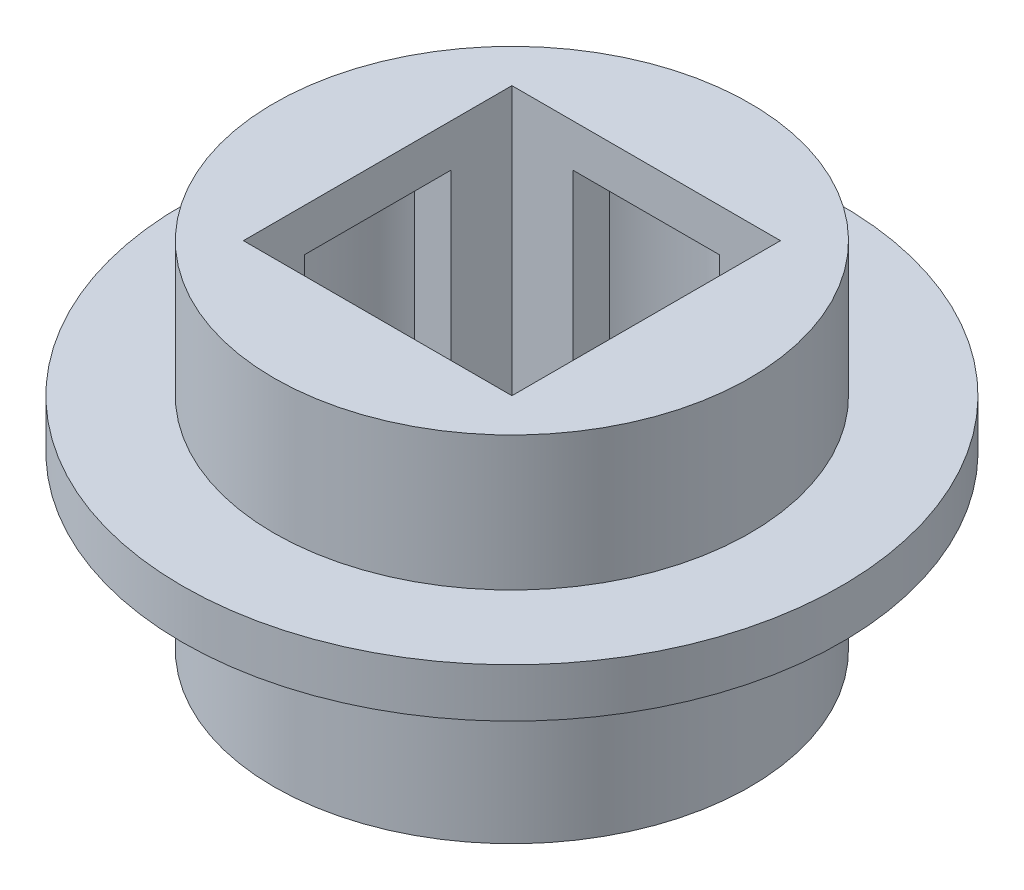
ISO-10303-21;
HEADER;
FILE_DESCRIPTION(('STEP AP214'),'2;1');
FILE_NAME('part.step','',(''),(''),'','','');
FILE_SCHEMA(('AUTOMOTIVE_DESIGN { 1 0 10303 214 1 1 1 1 }'));
ENDSEC;
DATA;
#1=APPLICATION_CONTEXT('core data for automotive mechanical design processes');
#2=APPLICATION_PROTOCOL_DEFINITION('international standard','automotive_design',2000,#1);
#3=PRODUCT_CONTEXT('',#1,'mechanical');
#4=PRODUCT('Part','Part','',(#3));
#5=PRODUCT_RELATED_PRODUCT_CATEGORY('part','',(#4));
#6=PRODUCT_DEFINITION_FORMATION('','',#4);
#7=PRODUCT_DEFINITION_CONTEXT('part definition',#1,'design');
#8=PRODUCT_DEFINITION('design','',#6,#7);
#9=PRODUCT_DEFINITION_SHAPE('','',#8);
#10=(LENGTH_UNIT() NAMED_UNIT(*) SI_UNIT(.MILLI.,.METRE.));
#11=(NAMED_UNIT(*) PLANE_ANGLE_UNIT() SI_UNIT($,.RADIAN.));
#12=(NAMED_UNIT(*) SI_UNIT($,.STERADIAN.) SOLID_ANGLE_UNIT());
#13=UNCERTAINTY_MEASURE_WITH_UNIT(LENGTH_MEASURE(1.E-05),#10,'distance_accuracy_value','');
#14=(GEOMETRIC_REPRESENTATION_CONTEXT(3) GLOBAL_UNCERTAINTY_ASSIGNED_CONTEXT((#13)) GLOBAL_UNIT_ASSIGNED_CONTEXT((#10,
#11,#12)) REPRESENTATION_CONTEXT('',''));
#15=CARTESIAN_POINT('',(0.,0.,0.));
#16=DIRECTION('',(0.,0.,1.));
#17=DIRECTION('',(1.,0.,0.));
#18=AXIS2_PLACEMENT_3D('',#15,#16,#17);
#19=CARTESIAN_POINT('',(0.,-14.,0.));
#20=DIRECTION('',(0.,1.,0.));
#21=DIRECTION('',(0.,0.,1.));
#22=AXIS2_PLACEMENT_3D('',#19,#20,#21);
#23=CYLINDRICAL_SURFACE('',#22,19.5);
#24=CARTESIAN_POINT('',(0.,-14.,0.));
#25=DIRECTION('',(0.,1.,0.));
#26=DIRECTION('',(0.,0.,1.));
#27=AXIS2_PLACEMENT_3D('',#24,#25,#26);
#28=CIRCLE('',#27,19.5);
#29=CARTESIAN_POINT('',(0.,-14.,19.5));
#30=VERTEX_POINT('',#29);
#31=EDGE_CURVE('E12',#30,#30,#28,.T.);
#32=ORIENTED_EDGE('',*,*,#31,.T.);
#33=EDGE_LOOP('',(#32));
#34=FACE_BOUND('',#33,.T.);
#35=CARTESIAN_POINT('',(0.,15.,0.));
#36=DIRECTION('',(0.,1.,0.));
#37=DIRECTION('',(0.,0.,1.));
#38=AXIS2_PLACEMENT_3D('',#35,#36,#37);
#39=CIRCLE('',#38,19.5);
#40=CARTESIAN_POINT('',(0.,15.,19.5));
#41=VERTEX_POINT('',#40);
#42=EDGE_CURVE('E50',#41,#41,#39,.T.);
#43=ORIENTED_EDGE('',*,*,#42,.F.);
#44=EDGE_LOOP('',(#43));
#45=FACE_BOUND('',#44,.T.);
#46=ADVANCED_FACE('F43',(#34,#45),#23,.T.);
#47=CARTESIAN_POINT('',(0.,-14.,0.));
#48=DIRECTION('',(0.,1.,0.));
#49=DIRECTION('',(0.,0.,1.));
#50=AXIS2_PLACEMENT_3D('',#47,#48,#49);
#51=PLANE('',#50);
#52=CARTESIAN_POINT('',(0.,-14.,8.));
#53=DIRECTION('',(0.,-1.,0.));
#54=DIRECTION('',(0.,0.,1.));
#55=AXIS2_PLACEMENT_3D('',#52,#53,#54);
#56=CIRCLE('',#55,8.48528137423857);
#57=CARTESIAN_POINT('',(6.,-14.,14.));
#58=VERTEX_POINT('',#57);
#59=CARTESIAN_POINT('',(-6.,-14.,14.));
#60=VERTEX_POINT('',#59);
#61=EDGE_CURVE('E203',#58,#60,#56,.T.);
#62=ORIENTED_EDGE('',*,*,#61,.F.);
#63=DIRECTION('',(0.,0.,1.));
#64=VECTOR('',#63,1.);
#65=CARTESIAN_POINT('',(6.,-14.,11.));
#66=LINE('',#65,#64);
#67=CARTESIAN_POINT('',(6.,-14.,11.));
#68=VERTEX_POINT('',#67);
#69=EDGE_CURVE('E188',#68,#58,#66,.T.);
#70=ORIENTED_EDGE('',*,*,#69,.F.);
#71=DIRECTION('',(-1.,0.,0.));
#72=VECTOR('',#71,1.);
#73=CARTESIAN_POINT('',(-11.,-14.,11.));
#74=LINE('',#73,#72);
#75=CARTESIAN_POINT('',(11.,-14.,11.));
#76=VERTEX_POINT('',#75);
#77=EDGE_CURVE('E302',#76,#68,#74,.T.);
#78=ORIENTED_EDGE('',*,*,#77,.F.);
#79=DIRECTION('',(0.,0.,1.));
#80=VECTOR('',#79,1.);
#81=CARTESIAN_POINT('',(11.,-14.,11.));
#82=LINE('',#81,#80);
#83=CARTESIAN_POINT('',(11.,-14.,5.99999999999996));
#84=VERTEX_POINT('',#83);
#85=EDGE_CURVE('E305',#84,#76,#82,.T.);
#86=ORIENTED_EDGE('',*,*,#85,.F.);
#87=DIRECTION('',(-1.,0.,0.));
#88=VECTOR('',#87,1.);
#89=CARTESIAN_POINT('',(11.,-14.,5.99999999999996));
#90=LINE('',#89,#88);
#91=CARTESIAN_POINT('',(14.,-14.,5.99999999999995));
#92=VERTEX_POINT('',#91);
#93=EDGE_CURVE('E222',#92,#84,#90,.T.);
#94=ORIENTED_EDGE('',*,*,#93,.F.);
#95=CARTESIAN_POINT('',(8.,-14.,0.));
#96=DIRECTION('',(0.,-1.,0.));
#97=DIRECTION('',(0.,0.,1.));
#98=AXIS2_PLACEMENT_3D('',#95,#96,#97);
#99=CIRCLE('',#98,8.48528137423857);
#100=CARTESIAN_POINT('',(14.,-14.,-6.00000000000005));
#101=VERTEX_POINT('',#100);
#102=EDGE_CURVE('E231',#101,#92,#99,.T.);
#103=ORIENTED_EDGE('',*,*,#102,.F.);
#104=DIRECTION('',(1.,0.,0.));
#105=VECTOR('',#104,1.);
#106=CARTESIAN_POINT('',(11.,-14.,-6.00000000000004));
#107=LINE('',#106,#105);
#108=CARTESIAN_POINT('',(11.,-14.,-6.00000000000004));
#109=VERTEX_POINT('',#108);
#110=EDGE_CURVE('E228',#109,#101,#107,.T.);
#111=ORIENTED_EDGE('',*,*,#110,.F.);
#112=CARTESIAN_POINT('',(11.,-14.,-11.));
#113=VERTEX_POINT('',#112);
#114=EDGE_CURVE('E306',#113,#109,#82,.T.);
#115=ORIENTED_EDGE('',*,*,#114,.F.);
#116=DIRECTION('',(1.,0.,0.));
#117=VECTOR('',#116,1.);
#118=CARTESIAN_POINT('',(-11.,-14.,-11.));
#119=LINE('',#118,#117);
#120=CARTESIAN_POINT('',(5.99999999999992,-14.,-11.));
#121=VERTEX_POINT('',#120);
#122=EDGE_CURVE('E323',#121,#113,#119,.T.);
#123=ORIENTED_EDGE('',*,*,#122,.F.);
#124=DIRECTION('',(0.,0.,1.));
#125=VECTOR('',#124,1.);
#126=CARTESIAN_POINT('',(5.99999999999992,-14.,-11.));
#127=LINE('',#126,#125);
#128=CARTESIAN_POINT('',(5.9999999999999,-14.,-14.));
#129=VERTEX_POINT('',#128);
#130=EDGE_CURVE('E247',#129,#121,#127,.T.);
#131=ORIENTED_EDGE('',*,*,#130,.F.);
#132=CARTESIAN_POINT('',(0.,-14.,-8.));
#133=DIRECTION('',(0.,-1.,0.));
#134=DIRECTION('',(0.,0.,1.));
#135=AXIS2_PLACEMENT_3D('',#132,#133,#134);
#136=CIRCLE('',#135,8.48528137423857);
#137=CARTESIAN_POINT('',(-6.0000000000001,-14.,-14.));
#138=VERTEX_POINT('',#137);
#139=EDGE_CURVE('E259',#138,#129,#136,.T.);
#140=ORIENTED_EDGE('',*,*,#139,.F.);
#141=DIRECTION('',(0.,0.,-1.));
#142=VECTOR('',#141,1.);
#143=CARTESIAN_POINT('',(-6.00000000000008,-14.,-11.));
#144=LINE('',#143,#142);
#145=CARTESIAN_POINT('',(-6.00000000000008,-14.,-11.));
#146=VERTEX_POINT('',#145);
#147=EDGE_CURVE('E256',#146,#138,#144,.T.);
#148=ORIENTED_EDGE('',*,*,#147,.F.);
#149=CARTESIAN_POINT('',(-11.,-14.,-11.));
#150=VERTEX_POINT('',#149);
#151=EDGE_CURVE('E330',#150,#146,#119,.T.);
#152=ORIENTED_EDGE('',*,*,#151,.F.);
#153=DIRECTION('',(0.,0.,-1.));
#154=VECTOR('',#153,1.);
#155=CARTESIAN_POINT('',(-11.,-14.,11.));
#156=LINE('',#155,#154);
#157=CARTESIAN_POINT('',(-11.0000000000001,-14.,-5.99999999999988));
#158=VERTEX_POINT('',#157);
#159=EDGE_CURVE('E213',#158,#150,#156,.T.);
#160=ORIENTED_EDGE('',*,*,#159,.F.);
#161=DIRECTION('',(1.,0.,0.));
#162=VECTOR('',#161,1.);
#163=CARTESIAN_POINT('',(-11.0000000000001,-14.,-5.99999999999988));
#164=LINE('',#163,#162);
#165=CARTESIAN_POINT('',(-14.0000000000001,-14.,-5.99999999999985));
#166=VERTEX_POINT('',#165);
#167=EDGE_CURVE('E275',#166,#158,#164,.T.);
#168=ORIENTED_EDGE('',*,*,#167,.F.);
#169=CARTESIAN_POINT('',(-8.,-14.,0.));
#170=DIRECTION('',(0.,-1.,0.));
#171=DIRECTION('',(0.,0.,1.));
#172=AXIS2_PLACEMENT_3D('',#169,#170,#171);
#173=CIRCLE('',#172,8.48528137423857);
#174=CARTESIAN_POINT('',(-13.9999999999999,-14.,6.00000000000014));
#175=VERTEX_POINT('',#174);
#176=EDGE_CURVE('E287',#175,#166,#173,.T.);
#177=ORIENTED_EDGE('',*,*,#176,.F.);
#178=DIRECTION('',(-1.,0.,0.));
#179=VECTOR('',#178,1.);
#180=CARTESIAN_POINT('',(-10.9999999999999,-14.,6.00000000000012));
#181=LINE('',#180,#179);
#182=CARTESIAN_POINT('',(-10.9999999999999,-14.,6.00000000000012));
#183=VERTEX_POINT('',#182);
#184=EDGE_CURVE('E284',#183,#175,#181,.T.);
#185=ORIENTED_EDGE('',*,*,#184,.F.);
#186=CARTESIAN_POINT('',(-11.,-14.,11.));
#187=VERTEX_POINT('',#186);
#188=EDGE_CURVE('E298',#187,#183,#156,.T.);
#189=ORIENTED_EDGE('',*,*,#188,.F.);
#190=CARTESIAN_POINT('',(-6.,-14.,11.));
#191=VERTEX_POINT('',#190);
#192=EDGE_CURVE('E301',#191,#187,#74,.T.);
#193=ORIENTED_EDGE('',*,*,#192,.F.);
#194=DIRECTION('',(0.,0.,-1.));
#195=VECTOR('',#194,1.);
#196=CARTESIAN_POINT('',(-6.,-14.,11.));
#197=LINE('',#196,#195);
#198=EDGE_CURVE('E201',#60,#191,#197,.T.);
#199=ORIENTED_EDGE('',*,*,#198,.F.);
#200=EDGE_LOOP('',(#62,#70,#78,#86,#94,#103,#111,#115,#123,#131,#140,#148,#152,#160,#168,#177,
#185,#189,#193,#199));
#201=FACE_BOUND('',#200,.T.);
#202=ORIENTED_EDGE('',*,*,#31,.F.);
#203=EDGE_LOOP('',(#202));
#204=FACE_BOUND('',#203,.T.);
#205=ADVANCED_FACE('F338',(#201,#204),#51,.F.);
#206=CARTESIAN_POINT('',(0.,15.,0.));
#207=DIRECTION('',(0.,1.,0.));
#208=DIRECTION('',(0.,0.,1.));
#209=AXIS2_PLACEMENT_3D('',#206,#207,#208);
#210=PLANE('',#209);
#211=DIRECTION('',(0.,0.,-1.));
#212=VECTOR('',#211,1.);
#213=CARTESIAN_POINT('',(11.,15.,11.));
#214=LINE('',#213,#212);
#215=CARTESIAN_POINT('',(11.,15.,11.));
#216=VERTEX_POINT('',#215);
#217=CARTESIAN_POINT('',(11.,15.,-11.));
#218=VERTEX_POINT('',#217);
#219=EDGE_CURVE('E309',#216,#218,#214,.T.);
#220=ORIENTED_EDGE('',*,*,#219,.F.);
#221=DIRECTION('',(1.,0.,0.));
#222=VECTOR('',#221,1.);
#223=CARTESIAN_POINT('',(-11.,15.,11.));
#224=LINE('',#223,#222);
#225=CARTESIAN_POINT('',(-11.,15.,11.));
#226=VERTEX_POINT('',#225);
#227=EDGE_CURVE('E317',#226,#216,#224,.T.);
#228=ORIENTED_EDGE('',*,*,#227,.F.);
#229=DIRECTION('',(0.,0.,1.));
#230=VECTOR('',#229,1.);
#231=CARTESIAN_POINT('',(-11.,15.,11.));
#232=LINE('',#231,#230);
#233=CARTESIAN_POINT('',(-11.,15.,-11.));
#234=VERTEX_POINT('',#233);
#235=EDGE_CURVE('E314',#234,#226,#232,.T.);
#236=ORIENTED_EDGE('',*,*,#235,.F.);
#237=DIRECTION('',(-1.,0.,0.));
#238=VECTOR('',#237,1.);
#239=CARTESIAN_POINT('',(-11.,15.,-11.));
#240=LINE('',#239,#238);
#241=EDGE_CURVE('E311',#218,#234,#240,.T.);
#242=ORIENTED_EDGE('',*,*,#241,.F.);
#243=EDGE_LOOP('',(#220,#228,#236,#242));
#244=FACE_BOUND('',#243,.T.);
#245=ORIENTED_EDGE('',*,*,#42,.T.);
#246=EDGE_LOOP('',(#245));
#247=FACE_BOUND('',#246,.T.);
#248=ADVANCED_FACE('F335',(#244,#247),#210,.T.);
#249=CARTESIAN_POINT('',(11.,-14.001,11.));
#250=DIRECTION('',(1.,0.,0.));
#251=DIRECTION('',(0.,0.,-1.));
#252=AXIS2_PLACEMENT_3D('',#249,#250,#251);
#253=PLANE('',#252);
#254=ORIENTED_EDGE('',*,*,#114,.T.);
#255=DIRECTION('',(0.,-1.,0.));
#256=VECTOR('',#255,1.);
#257=CARTESIAN_POINT('',(11.,11.5,-6.00000000000004));
#258=LINE('',#257,#256);
#259=CARTESIAN_POINT('',(11.,11.5,-6.00000000000004));
#260=VERTEX_POINT('',#259);
#261=EDGE_CURVE('E209',#260,#109,#258,.T.);
#262=ORIENTED_EDGE('',*,*,#261,.F.);
#263=DIRECTION('',(0.,0.,-1.));
#264=VECTOR('',#263,1.);
#265=CARTESIAN_POINT('',(11.,11.5,5.99999999999996));
#266=LINE('',#265,#264);
#267=CARTESIAN_POINT('',(11.,11.5,5.99999999999996));
#268=VERTEX_POINT('',#267);
#269=EDGE_CURVE('E225',#268,#260,#266,.T.);
#270=ORIENTED_EDGE('',*,*,#269,.F.);
#271=DIRECTION('',(0.,-1.,0.));
#272=VECTOR('',#271,1.);
#273=CARTESIAN_POINT('',(11.,11.5,5.99999999999996));
#274=LINE('',#273,#272);
#275=EDGE_CURVE('E237',#268,#84,#274,.T.);
#276=ORIENTED_EDGE('',*,*,#275,.T.);
#277=ORIENTED_EDGE('',*,*,#85,.T.);
#278=DIRECTION('',(0.,1.,0.));
#279=VECTOR('',#278,1.);
#280=CARTESIAN_POINT('',(11.,-14.001,11.));
#281=LINE('',#280,#279);
#282=EDGE_CURVE('E321',#76,#216,#281,.T.);
#283=ORIENTED_EDGE('',*,*,#282,.T.);
#284=ORIENTED_EDGE('',*,*,#219,.T.);
#285=DIRECTION('',(0.,1.,0.));
#286=VECTOR('',#285,1.);
#287=CARTESIAN_POINT('',(11.,-14.001,-11.));
#288=LINE('',#287,#286);
#289=EDGE_CURVE('E320',#113,#218,#288,.T.);
#290=ORIENTED_EDGE('',*,*,#289,.F.);
#291=EDGE_LOOP('',(#254,#262,#270,#276,#277,#283,#284,#290));
#292=FACE_BOUND('',#291,.T.);
#293=ADVANCED_FACE('F349',(#292),#253,.F.);
#294=CARTESIAN_POINT('',(-11.,-14.001,11.));
#295=DIRECTION('',(0.,0.,1.));
#296=DIRECTION('',(1.,0.,0.));
#297=AXIS2_PLACEMENT_3D('',#294,#295,#296);
#298=PLANE('',#297);
#299=ORIENTED_EDGE('',*,*,#77,.T.);
#300=DIRECTION('',(0.,-1.,0.));
#301=VECTOR('',#300,1.);
#302=CARTESIAN_POINT('',(6.,11.5,11.));
#303=LINE('',#302,#301);
#304=CARTESIAN_POINT('',(6.,11.5,11.));
#305=VERTEX_POINT('',#304);
#306=EDGE_CURVE('E211',#305,#68,#303,.T.);
#307=ORIENTED_EDGE('',*,*,#306,.F.);
#308=DIRECTION('',(1.,0.,0.));
#309=VECTOR('',#308,1.);
#310=CARTESIAN_POINT('',(-6.,11.5,11.));
#311=LINE('',#310,#309);
#312=CARTESIAN_POINT('',(-6.,11.5,11.));
#313=VERTEX_POINT('',#312);
#314=EDGE_CURVE('E193',#313,#305,#311,.T.);
#315=ORIENTED_EDGE('',*,*,#314,.F.);
#316=DIRECTION('',(0.,-1.,0.));
#317=VECTOR('',#316,1.);
#318=CARTESIAN_POINT('',(-6.,11.5,11.));
#319=LINE('',#318,#317);
#320=EDGE_CURVE('E214',#313,#191,#319,.T.);
#321=ORIENTED_EDGE('',*,*,#320,.T.);
#322=ORIENTED_EDGE('',*,*,#192,.T.);
#323=DIRECTION('',(0.,1.,0.));
#324=VECTOR('',#323,1.);
#325=CARTESIAN_POINT('',(-11.,-14.001,11.));
#326=LINE('',#325,#324);
#327=EDGE_CURVE('E324',#187,#226,#326,.T.);
#328=ORIENTED_EDGE('',*,*,#327,.T.);
#329=ORIENTED_EDGE('',*,*,#227,.T.);
#330=ORIENTED_EDGE('',*,*,#282,.F.);
#331=EDGE_LOOP('',(#299,#307,#315,#321,#322,#328,#329,#330));
#332=FACE_BOUND('',#331,.T.);
#333=ADVANCED_FACE('F355',(#332),#298,.F.);
#334=CARTESIAN_POINT('',(-11.,-14.001,11.));
#335=DIRECTION('',(-1.,0.,0.));
#336=DIRECTION('',(0.,0.,1.));
#337=AXIS2_PLACEMENT_3D('',#334,#335,#336);
#338=PLANE('',#337);
#339=ORIENTED_EDGE('',*,*,#188,.T.);
#340=DIRECTION('',(0.,-1.,0.));
#341=VECTOR('',#340,1.);
#342=CARTESIAN_POINT('',(-10.9999999999999,11.5,6.00000000000012));
#343=LINE('',#342,#341);
#344=CARTESIAN_POINT('',(-10.9999999999999,11.5,6.00000000000012));
#345=VERTEX_POINT('',#344);
#346=EDGE_CURVE('E260',#345,#183,#343,.T.);
#347=ORIENTED_EDGE('',*,*,#346,.F.);
#348=DIRECTION('',(0.,0.,1.));
#349=VECTOR('',#348,1.);
#350=CARTESIAN_POINT('',(-11.0000000000001,11.5,-5.99999999999988));
#351=LINE('',#350,#349);
#352=CARTESIAN_POINT('',(-11.,11.5,-5.99999999999988));
#353=VERTEX_POINT('',#352);
#354=EDGE_CURVE('E280',#353,#345,#351,.T.);
#355=ORIENTED_EDGE('',*,*,#354,.F.);
#356=DIRECTION('',(0.,-1.,0.));
#357=VECTOR('',#356,1.);
#358=CARTESIAN_POINT('',(-11.0000000000001,11.5,-5.99999999999988));
#359=LINE('',#358,#357);
#360=EDGE_CURVE('E292',#353,#158,#359,.T.);
#361=ORIENTED_EDGE('',*,*,#360,.T.);
#362=ORIENTED_EDGE('',*,*,#159,.T.);
#363=DIRECTION('',(0.,1.,0.));
#364=VECTOR('',#363,1.);
#365=CARTESIAN_POINT('',(-11.,-14.001,-11.));
#366=LINE('',#365,#364);
#367=EDGE_CURVE('E326',#150,#234,#366,.T.);
#368=ORIENTED_EDGE('',*,*,#367,.T.);
#369=ORIENTED_EDGE('',*,*,#235,.T.);
#370=ORIENTED_EDGE('',*,*,#327,.F.);
#371=EDGE_LOOP('',(#339,#347,#355,#361,#362,#368,#369,#370));
#372=FACE_BOUND('',#371,.T.);
#373=ADVANCED_FACE('F361',(#372),#338,.F.);
#374=CARTESIAN_POINT('',(-11.,-14.001,-11.));
#375=DIRECTION('',(0.,0.,-1.));
#376=DIRECTION('',(-1.,0.,0.));
#377=AXIS2_PLACEMENT_3D('',#374,#375,#376);
#378=PLANE('',#377);
#379=ORIENTED_EDGE('',*,*,#151,.T.);
#380=DIRECTION('',(0.,-1.,0.));
#381=VECTOR('',#380,1.);
#382=CARTESIAN_POINT('',(-6.00000000000008,11.5,-11.));
#383=LINE('',#382,#381);
#384=CARTESIAN_POINT('',(-6.00000000000008,11.5,-11.));
#385=VERTEX_POINT('',#384);
#386=EDGE_CURVE('E232',#385,#146,#383,.T.);
#387=ORIENTED_EDGE('',*,*,#386,.F.);
#388=DIRECTION('',(-1.,0.,0.));
#389=VECTOR('',#388,1.);
#390=CARTESIAN_POINT('',(5.99999999999992,11.5,-11.));
#391=LINE('',#390,#389);
#392=CARTESIAN_POINT('',(5.99999999999992,11.5,-11.));
#393=VERTEX_POINT('',#392);
#394=EDGE_CURVE('E252',#393,#385,#391,.T.);
#395=ORIENTED_EDGE('',*,*,#394,.F.);
#396=DIRECTION('',(0.,-1.,0.));
#397=VECTOR('',#396,1.);
#398=CARTESIAN_POINT('',(5.99999999999992,11.5,-11.));
#399=LINE('',#398,#397);
#400=EDGE_CURVE('E265',#393,#121,#399,.T.);
#401=ORIENTED_EDGE('',*,*,#400,.T.);
#402=ORIENTED_EDGE('',*,*,#122,.T.);
#403=ORIENTED_EDGE('',*,*,#289,.T.);
#404=ORIENTED_EDGE('',*,*,#241,.T.);
#405=ORIENTED_EDGE('',*,*,#367,.F.);
#406=EDGE_LOOP('',(#379,#387,#395,#401,#402,#403,#404,#405));
#407=FACE_BOUND('',#406,.T.);
#408=ADVANCED_FACE('F357',(#407),#378,.F.);
#409=CARTESIAN_POINT('',(-6.00000000000008,11.5,-11.));
#410=DIRECTION('',(-1.,0.,0.));
#411=DIRECTION('',(0.,0.,1.));
#412=AXIS2_PLACEMENT_3D('',#409,#410,#411);
#413=PLANE('',#412);
#414=ORIENTED_EDGE('',*,*,#147,.T.);
#415=DIRECTION('',(0.,-1.,0.));
#416=VECTOR('',#415,1.);
#417=CARTESIAN_POINT('',(-6.0000000000001,11.5,-14.));
#418=LINE('',#417,#416);
#419=CARTESIAN_POINT('',(-6.0000000000001,11.5,-14.));
#420=VERTEX_POINT('',#419);
#421=EDGE_CURVE('E255',#420,#138,#418,.T.);
#422=ORIENTED_EDGE('',*,*,#421,.F.);
#423=DIRECTION('',(0.,0.,-1.));
#424=VECTOR('',#423,1.);
#425=CARTESIAN_POINT('',(-6.00000000000008,11.5,-11.));
#426=LINE('',#425,#424);
#427=EDGE_CURVE('E243',#385,#420,#426,.T.);
#428=ORIENTED_EDGE('',*,*,#427,.F.);
#429=ORIENTED_EDGE('',*,*,#386,.T.);
#430=EDGE_LOOP('',(#414,#422,#428,#429));
#431=FACE_BOUND('',#430,.T.);
#432=ADVANCED_FACE('F360',(#431),#413,.F.);
#433=CARTESIAN_POINT('',(5.99999999999992,11.5,-11.));
#434=DIRECTION('',(1.,0.,0.));
#435=DIRECTION('',(0.,0.,-1.));
#436=AXIS2_PLACEMENT_3D('',#433,#434,#435);
#437=PLANE('',#436);
#438=ORIENTED_EDGE('',*,*,#130,.T.);
#439=ORIENTED_EDGE('',*,*,#400,.F.);
#440=DIRECTION('',(0.,0.,1.));
#441=VECTOR('',#440,1.);
#442=CARTESIAN_POINT('',(5.99999999999992,11.5,-11.));
#443=LINE('',#442,#441);
#444=CARTESIAN_POINT('',(5.9999999999999,11.5,-14.));
#445=VERTEX_POINT('',#444);
#446=EDGE_CURVE('E250',#445,#393,#443,.T.);
#447=ORIENTED_EDGE('',*,*,#446,.F.);
#448=DIRECTION('',(0.,-1.,0.));
#449=VECTOR('',#448,1.);
#450=CARTESIAN_POINT('',(5.9999999999999,11.5,-14.));
#451=LINE('',#450,#449);
#452=EDGE_CURVE('E268',#445,#129,#451,.T.);
#453=ORIENTED_EDGE('',*,*,#452,.T.);
#454=EDGE_LOOP('',(#438,#439,#447,#453));
#455=FACE_BOUND('',#454,.T.);
#456=ADVANCED_FACE('F388',(#455),#437,.F.);
#457=CARTESIAN_POINT('',(0.,11.5,-8.));
#458=DIRECTION('',(0.,-1.,0.));
#459=DIRECTION('',(0.,0.,-1.));
#460=AXIS2_PLACEMENT_3D('',#457,#458,#459);
#461=CYLINDRICAL_SURFACE('',#460,8.48528137423857);
#462=ORIENTED_EDGE('',*,*,#139,.T.);
#463=ORIENTED_EDGE('',*,*,#452,.F.);
#464=CARTESIAN_POINT('',(0.,11.5,-8.));
#465=DIRECTION('',(0.,-1.,0.));
#466=DIRECTION('',(0.,0.,1.));
#467=AXIS2_PLACEMENT_3D('',#464,#465,#466);
#468=CIRCLE('',#467,8.48528137423857);
#469=EDGE_CURVE('E246',#420,#445,#468,.T.);
#470=ORIENTED_EDGE('',*,*,#469,.F.);
#471=ORIENTED_EDGE('',*,*,#421,.T.);
#472=EDGE_LOOP('',(#462,#463,#470,#471));
#473=FACE_BOUND('',#472,.T.);
#474=ADVANCED_FACE('F390',(#473),#461,.F.);
#475=CARTESIAN_POINT('',(0.,11.5,-8.));
#476=DIRECTION('',(0.,1.,0.));
#477=DIRECTION('',(0.,0.,1.));
#478=AXIS2_PLACEMENT_3D('',#475,#476,#477);
#479=PLANE('',#478);
#480=ORIENTED_EDGE('',*,*,#427,.T.);
#481=ORIENTED_EDGE('',*,*,#469,.T.);
#482=ORIENTED_EDGE('',*,*,#446,.T.);
#483=ORIENTED_EDGE('',*,*,#394,.T.);
#484=EDGE_LOOP('',(#480,#481,#482,#483));
#485=FACE_BOUND('',#484,.T.);
#486=ADVANCED_FACE('F373',(#485),#479,.F.);
#487=CARTESIAN_POINT('',(-10.9999999999999,11.5,6.00000000000012));
#488=DIRECTION('',(0.,0.,1.));
#489=DIRECTION('',(1.,0.,0.));
#490=AXIS2_PLACEMENT_3D('',#487,#488,#489);
#491=PLANE('',#490);
#492=ORIENTED_EDGE('',*,*,#184,.T.);
#493=DIRECTION('',(0.,-1.,0.));
#494=VECTOR('',#493,1.);
#495=CARTESIAN_POINT('',(-13.9999999999999,11.5,6.00000000000014));
#496=LINE('',#495,#494);
#497=CARTESIAN_POINT('',(-13.9999999999999,11.5,6.00000000000014));
#498=VERTEX_POINT('',#497);
#499=EDGE_CURVE('E283',#498,#175,#496,.T.);
#500=ORIENTED_EDGE('',*,*,#499,.F.);
#501=DIRECTION('',(-1.,0.,0.));
#502=VECTOR('',#501,1.);
#503=CARTESIAN_POINT('',(-10.9999999999999,11.5,6.00000000000012));
#504=LINE('',#503,#502);
#505=EDGE_CURVE('E271',#345,#498,#504,.T.);
#506=ORIENTED_EDGE('',*,*,#505,.F.);
#507=ORIENTED_EDGE('',*,*,#346,.T.);
#508=EDGE_LOOP('',(#492,#500,#506,#507));
#509=FACE_BOUND('',#508,.T.);
#510=ADVANCED_FACE('F369',(#509),#491,.F.);
#511=CARTESIAN_POINT('',(-11.0000000000001,11.5,-5.99999999999988));
#512=DIRECTION('',(0.,0.,-1.));
#513=DIRECTION('',(-1.,0.,0.));
#514=AXIS2_PLACEMENT_3D('',#511,#512,#513);
#515=PLANE('',#514);
#516=ORIENTED_EDGE('',*,*,#167,.T.);
#517=ORIENTED_EDGE('',*,*,#360,.F.);
#518=DIRECTION('',(1.,0.,0.));
#519=VECTOR('',#518,1.);
#520=CARTESIAN_POINT('',(-11.0000000000001,11.5,-5.99999999999988));
#521=LINE('',#520,#519);
#522=CARTESIAN_POINT('',(-14.0000000000001,11.5,-5.99999999999985));
#523=VERTEX_POINT('',#522);
#524=EDGE_CURVE('E278',#523,#353,#521,.T.);
#525=ORIENTED_EDGE('',*,*,#524,.F.);
#526=DIRECTION('',(0.,-1.,0.));
#527=VECTOR('',#526,1.);
#528=CARTESIAN_POINT('',(-14.0000000000001,11.5,-5.99999999999985));
#529=LINE('',#528,#527);
#530=EDGE_CURVE('E295',#523,#166,#529,.T.);
#531=ORIENTED_EDGE('',*,*,#530,.T.);
#532=EDGE_LOOP('',(#516,#517,#525,#531));
#533=FACE_BOUND('',#532,.T.);
#534=ADVANCED_FACE('F372',(#533),#515,.F.);
#535=CARTESIAN_POINT('',(-8.,11.5,0.));
#536=DIRECTION('',(0.,-1.,0.));
#537=DIRECTION('',(0.,0.,-1.));
#538=AXIS2_PLACEMENT_3D('',#535,#536,#537);
#539=CYLINDRICAL_SURFACE('',#538,8.48528137423857);
#540=ORIENTED_EDGE('',*,*,#176,.T.);
#541=ORIENTED_EDGE('',*,*,#530,.F.);
#542=CARTESIAN_POINT('',(-8.,11.5,0.));
#543=DIRECTION('',(0.,-1.,0.));
#544=DIRECTION('',(0.,0.,1.));
#545=AXIS2_PLACEMENT_3D('',#542,#543,#544);
#546=CIRCLE('',#545,8.48528137423857);
#547=EDGE_CURVE('E274',#498,#523,#546,.T.);
#548=ORIENTED_EDGE('',*,*,#547,.F.);
#549=ORIENTED_EDGE('',*,*,#499,.T.);
#550=EDGE_LOOP('',(#540,#541,#548,#549));
#551=FACE_BOUND('',#550,.T.);
#552=ADVANCED_FACE('F375',(#551),#539,.F.);
#553=CARTESIAN_POINT('',(-8.,11.5,0.));
#554=DIRECTION('',(0.,1.,0.));
#555=DIRECTION('',(0.,0.,1.));
#556=AXIS2_PLACEMENT_3D('',#553,#554,#555);
#557=PLANE('',#556);
#558=ORIENTED_EDGE('',*,*,#505,.T.);
#559=ORIENTED_EDGE('',*,*,#547,.T.);
#560=ORIENTED_EDGE('',*,*,#524,.T.);
#561=ORIENTED_EDGE('',*,*,#354,.T.);
#562=EDGE_LOOP('',(#558,#559,#560,#561));
#563=FACE_BOUND('',#562,.T.);
#564=ADVANCED_FACE('F378',(#563),#557,.F.);
#565=CARTESIAN_POINT('',(6.,11.5,11.));
#566=DIRECTION('',(1.,0.,0.));
#567=DIRECTION('',(0.,0.,-1.));
#568=AXIS2_PLACEMENT_3D('',#565,#566,#567);
#569=PLANE('',#568);
#570=ORIENTED_EDGE('',*,*,#69,.T.);
#571=DIRECTION('',(0.,-1.,0.));
#572=VECTOR('',#571,1.);
#573=CARTESIAN_POINT('',(6.,11.5,14.));
#574=LINE('',#573,#572);
#575=CARTESIAN_POINT('',(6.,11.5,14.));
#576=VERTEX_POINT('',#575);
#577=EDGE_CURVE('E182',#576,#58,#574,.T.);
#578=ORIENTED_EDGE('',*,*,#577,.F.);
#579=DIRECTION('',(0.,0.,1.));
#580=VECTOR('',#579,1.);
#581=CARTESIAN_POINT('',(6.,11.5,11.));
#582=LINE('',#581,#580);
#583=EDGE_CURVE('E186',#305,#576,#582,.T.);
#584=ORIENTED_EDGE('',*,*,#583,.F.);
#585=ORIENTED_EDGE('',*,*,#306,.T.);
#586=EDGE_LOOP('',(#570,#578,#584,#585));
#587=FACE_BOUND('',#586,.T.);
#588=ADVANCED_FACE('F184',(#587),#569,.F.);
#589=CARTESIAN_POINT('',(-6.,11.5,11.));
#590=DIRECTION('',(-1.,0.,0.));
#591=DIRECTION('',(0.,0.,1.));
#592=AXIS2_PLACEMENT_3D('',#589,#590,#591);
#593=PLANE('',#592);
#594=ORIENTED_EDGE('',*,*,#198,.T.);
#595=ORIENTED_EDGE('',*,*,#320,.F.);
#596=DIRECTION('',(0.,0.,-1.));
#597=VECTOR('',#596,1.);
#598=CARTESIAN_POINT('',(-6.,11.5,11.));
#599=LINE('',#598,#597);
#600=CARTESIAN_POINT('',(-6.,11.5,14.));
#601=VERTEX_POINT('',#600);
#602=EDGE_CURVE('E65',#601,#313,#599,.T.);
#603=ORIENTED_EDGE('',*,*,#602,.F.);
#604=DIRECTION('',(0.,-1.,0.));
#605=VECTOR('',#604,1.);
#606=CARTESIAN_POINT('',(-6.,11.5,14.));
#607=LINE('',#606,#605);
#608=EDGE_CURVE('E192',#601,#60,#607,.T.);
#609=ORIENTED_EDGE('',*,*,#608,.T.);
#610=EDGE_LOOP('',(#594,#595,#603,#609));
#611=FACE_BOUND('',#610,.T.);
#612=ADVANCED_FACE('F417',(#611),#593,.F.);
#613=CARTESIAN_POINT('',(0.,11.5,8.));
#614=DIRECTION('',(0.,-1.,0.));
#615=DIRECTION('',(0.,0.,-1.));
#616=AXIS2_PLACEMENT_3D('',#613,#614,#615);
#617=CYLINDRICAL_SURFACE('',#616,8.48528137423857);
#618=ORIENTED_EDGE('',*,*,#61,.T.);
#619=ORIENTED_EDGE('',*,*,#608,.F.);
#620=CARTESIAN_POINT('',(0.,11.5,8.));
#621=DIRECTION('',(0.,-1.,0.));
#622=DIRECTION('',(0.,0.,1.));
#623=AXIS2_PLACEMENT_3D('',#620,#621,#622);
#624=CIRCLE('',#623,8.48528137423857);
#625=EDGE_CURVE('E195',#576,#601,#624,.T.);
#626=ORIENTED_EDGE('',*,*,#625,.F.);
#627=ORIENTED_EDGE('',*,*,#577,.T.);
#628=EDGE_LOOP('',(#618,#619,#626,#627));
#629=FACE_BOUND('',#628,.T.);
#630=ADVANCED_FACE('F196',(#629),#617,.F.);
#631=CARTESIAN_POINT('',(0.,11.5,8.));
#632=DIRECTION('',(0.,1.,0.));
#633=DIRECTION('',(0.,0.,1.));
#634=AXIS2_PLACEMENT_3D('',#631,#632,#633);
#635=PLANE('',#634);
#636=ORIENTED_EDGE('',*,*,#583,.T.);
#637=ORIENTED_EDGE('',*,*,#625,.T.);
#638=ORIENTED_EDGE('',*,*,#602,.T.);
#639=ORIENTED_EDGE('',*,*,#314,.T.);
#640=EDGE_LOOP('',(#636,#637,#638,#639));
#641=FACE_BOUND('',#640,.T.);
#642=ADVANCED_FACE('F198',(#641),#635,.F.);
#643=CARTESIAN_POINT('',(11.,11.5,-6.00000000000004));
#644=DIRECTION('',(0.,0.,-1.));
#645=DIRECTION('',(-1.,0.,0.));
#646=AXIS2_PLACEMENT_3D('',#643,#644,#645);
#647=PLANE('',#646);
#648=ORIENTED_EDGE('',*,*,#110,.T.);
#649=DIRECTION('',(0.,-1.,0.));
#650=VECTOR('',#649,1.);
#651=CARTESIAN_POINT('',(14.,11.5,-6.00000000000005));
#652=LINE('',#651,#650);
#653=CARTESIAN_POINT('',(14.,11.5,-6.00000000000005));
#654=VERTEX_POINT('',#653);
#655=EDGE_CURVE('E227',#654,#101,#652,.T.);
#656=ORIENTED_EDGE('',*,*,#655,.F.);
#657=DIRECTION('',(1.,0.,0.));
#658=VECTOR('',#657,1.);
#659=CARTESIAN_POINT('',(11.,11.5,-6.00000000000004));
#660=LINE('',#659,#658);
#661=EDGE_CURVE('E218',#260,#654,#660,.T.);
#662=ORIENTED_EDGE('',*,*,#661,.F.);
#663=ORIENTED_EDGE('',*,*,#261,.T.);
#664=EDGE_LOOP('',(#648,#656,#662,#663));
#665=FACE_BOUND('',#664,.T.);
#666=ADVANCED_FACE('F400',(#665),#647,.F.);
#667=CARTESIAN_POINT('',(11.,11.5,5.99999999999996));
#668=DIRECTION('',(0.,0.,1.));
#669=DIRECTION('',(1.,0.,0.));
#670=AXIS2_PLACEMENT_3D('',#667,#668,#669);
#671=PLANE('',#670);
#672=ORIENTED_EDGE('',*,*,#93,.T.);
#673=ORIENTED_EDGE('',*,*,#275,.F.);
#674=DIRECTION('',(-1.,0.,0.));
#675=VECTOR('',#674,1.);
#676=CARTESIAN_POINT('',(11.,11.5,5.99999999999996));
#677=LINE('',#676,#675);
#678=CARTESIAN_POINT('',(14.,11.5,5.99999999999995));
#679=VERTEX_POINT('',#678);
#680=EDGE_CURVE('E57',#679,#268,#677,.T.);
#681=ORIENTED_EDGE('',*,*,#680,.F.);
#682=DIRECTION('',(0.,-1.,0.));
#683=VECTOR('',#682,1.);
#684=CARTESIAN_POINT('',(14.,11.5,5.99999999999995));
#685=LINE('',#684,#683);
#686=EDGE_CURVE('E240',#679,#92,#685,.T.);
#687=ORIENTED_EDGE('',*,*,#686,.T.);
#688=EDGE_LOOP('',(#672,#673,#681,#687));
#689=FACE_BOUND('',#688,.T.);
#690=ADVANCED_FACE('F403',(#689),#671,.F.);
#691=CARTESIAN_POINT('',(8.,11.5,0.));
#692=DIRECTION('',(0.,-1.,0.));
#693=DIRECTION('',(0.,0.,-1.));
#694=AXIS2_PLACEMENT_3D('',#691,#692,#693);
#695=CYLINDRICAL_SURFACE('',#694,8.48528137423857);
#696=ORIENTED_EDGE('',*,*,#102,.T.);
#697=ORIENTED_EDGE('',*,*,#686,.F.);
#698=CARTESIAN_POINT('',(8.,11.5,0.));
#699=DIRECTION('',(0.,-1.,0.));
#700=DIRECTION('',(0.,0.,1.));
#701=AXIS2_PLACEMENT_3D('',#698,#699,#700);
#702=CIRCLE('',#701,8.48528137423857);
#703=EDGE_CURVE('E221',#654,#679,#702,.T.);
#704=ORIENTED_EDGE('',*,*,#703,.F.);
#705=ORIENTED_EDGE('',*,*,#655,.T.);
#706=EDGE_LOOP('',(#696,#697,#704,#705));
#707=FACE_BOUND('',#706,.T.);
#708=ADVANCED_FACE('F405',(#707),#695,.F.);
#709=CARTESIAN_POINT('',(8.,11.5,0.));
#710=DIRECTION('',(0.,1.,0.));
#711=DIRECTION('',(0.,0.,1.));
#712=AXIS2_PLACEMENT_3D('',#709,#710,#711);
#713=PLANE('',#712);
#714=ORIENTED_EDGE('',*,*,#661,.T.);
#715=ORIENTED_EDGE('',*,*,#703,.T.);
#716=ORIENTED_EDGE('',*,*,#680,.T.);
#717=ORIENTED_EDGE('',*,*,#269,.T.);
#718=EDGE_LOOP('',(#714,#715,#716,#717));
#719=FACE_BOUND('',#718,.T.);
#720=ADVANCED_FACE('F408',(#719),#713,.F.);
#721=CLOSED_SHELL('',(#46,#205,#248,#293,#333,#373,#408,#432,#456,#474,#486,#510,#534,#552,#564,
#588,#612,#630,#642,#666,#690,#708,#720));
#722=MANIFOLD_SOLID_BREP('B2',#721);
#723=CARTESIAN_POINT('',(0.,4.,0.));
#724=DIRECTION('',(0.,1.,0.));
#725=DIRECTION('',(0.,0.,1.));
#726=AXIS2_PLACEMENT_3D('',#723,#724,#725);
#727=PLANE('',#726);
#728=CARTESIAN_POINT('',(0.,4.,0.));
#729=DIRECTION('',(0.,1.,0.));
#730=DIRECTION('',(0.,0.,1.));
#731=AXIS2_PLACEMENT_3D('',#728,#729,#730);
#732=CIRCLE('',#731,27.);
#733=CARTESIAN_POINT('',(0.,4.,27.));
#734=VERTEX_POINT('',#733);
#735=EDGE_CURVE('E42',#734,#734,#732,.T.);
#736=ORIENTED_EDGE('',*,*,#735,.T.);
#737=EDGE_LOOP('',(#736));
#738=FACE_BOUND('',#737,.T.);
#739=CARTESIAN_POINT('',(0.,4.,0.));
#740=DIRECTION('',(0.,1.,0.));
#741=DIRECTION('',(0.,0.,1.));
#742=AXIS2_PLACEMENT_3D('',#739,#740,#741);
#743=CIRCLE('',#742,19.5);
#744=CARTESIAN_POINT('',(0.,4.,19.5));
#745=VERTEX_POINT('',#744);
#746=EDGE_CURVE('E611',#745,#745,#743,.T.);
#747=ORIENTED_EDGE('',*,*,#746,.F.);
#748=EDGE_LOOP('',(#747));
#749=FACE_BOUND('',#748,.T.);
#750=ADVANCED_FACE('F600',(#738,#749),#727,.T.);
#751=CARTESIAN_POINT('',(0.,0.,0.));
#752=DIRECTION('',(0.,1.,0.));
#753=DIRECTION('',(0.,0.,1.));
#754=AXIS2_PLACEMENT_3D('',#751,#752,#753);
#755=PLANE('',#754);
#756=CARTESIAN_POINT('',(0.,0.,0.));
#757=DIRECTION('',(0.,1.,0.));
#758=DIRECTION('',(0.,0.,1.));
#759=AXIS2_PLACEMENT_3D('',#756,#757,#758);
#760=CIRCLE('',#759,27.);
#761=CARTESIAN_POINT('',(0.,0.,27.));
#762=VERTEX_POINT('',#761);
#763=EDGE_CURVE('E604',#762,#762,#760,.T.);
#764=ORIENTED_EDGE('',*,*,#763,.F.);
#765=EDGE_LOOP('',(#764));
#766=FACE_BOUND('',#765,.T.);
#767=CARTESIAN_POINT('',(0.,0.,0.));
#768=DIRECTION('',(0.,1.,0.));
#769=DIRECTION('',(0.,0.,1.));
#770=AXIS2_PLACEMENT_3D('',#767,#768,#769);
#771=CIRCLE('',#770,19.5);
#772=CARTESIAN_POINT('',(0.,0.,19.5));
#773=VERTEX_POINT('',#772);
#774=EDGE_CURVE('E613',#773,#773,#771,.T.);
#775=ORIENTED_EDGE('',*,*,#774,.T.);
#776=EDGE_LOOP('',(#775));
#777=FACE_BOUND('',#776,.T.);
#778=ADVANCED_FACE('F623',(#766,#777),#755,.F.);
#779=CARTESIAN_POINT('',(0.,4.,0.));
#780=DIRECTION('',(0.,-1.,0.));
#781=DIRECTION('',(0.,0.,-1.));
#782=AXIS2_PLACEMENT_3D('',#779,#780,#781);
#783=CYLINDRICAL_SURFACE('',#782,27.);
#784=ORIENTED_EDGE('',*,*,#735,.F.);
#785=EDGE_LOOP('',(#784));
#786=FACE_BOUND('',#785,.T.);
#787=ORIENTED_EDGE('',*,*,#763,.T.);
#788=EDGE_LOOP('',(#787));
#789=FACE_BOUND('',#788,.T.);
#790=ADVANCED_FACE('F602',(#786,#789),#783,.T.);
#791=CARTESIAN_POINT('',(0.,4.,0.));
#792=DIRECTION('',(0.,-1.,0.));
#793=DIRECTION('',(0.,0.,-1.));
#794=AXIS2_PLACEMENT_3D('',#791,#792,#793);
#795=CYLINDRICAL_SURFACE('',#794,19.5);
#796=ORIENTED_EDGE('',*,*,#746,.T.);
#797=EDGE_LOOP('',(#796));
#798=FACE_BOUND('',#797,.T.);
#799=ORIENTED_EDGE('',*,*,#774,.F.);
#800=EDGE_LOOP('',(#799));
#801=FACE_BOUND('',#800,.T.);
#802=ADVANCED_FACE('F619',(#798,#801),#795,.F.);
#803=CLOSED_SHELL('',(#750,#778,#790,#802));
#804=MANIFOLD_SOLID_BREP('B6',#803);
#805=ADVANCED_BREP_SHAPE_REPRESENTATION('',(#18,#722,#804),#14);
#806=SHAPE_DEFINITION_REPRESENTATION(#9,#805);
ENDSEC;
END-ISO-10303-21;
